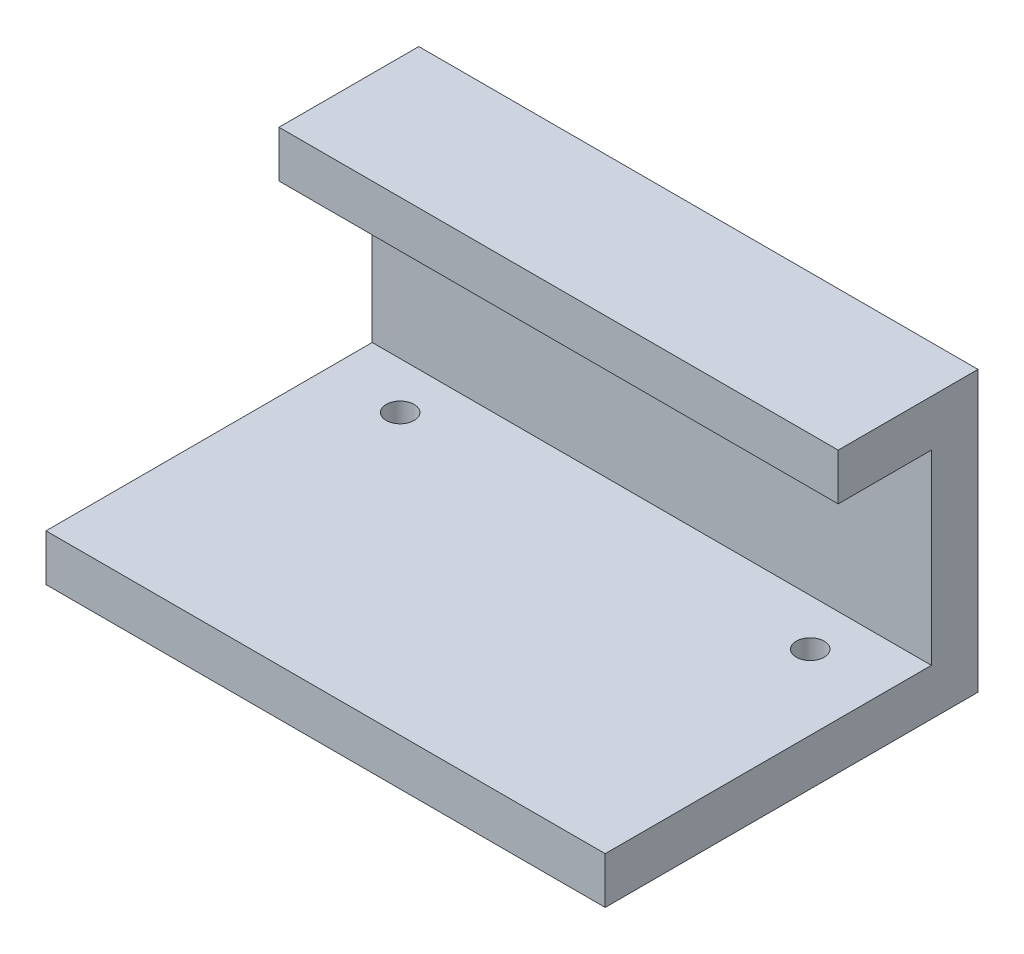
ISO-10303-21;
HEADER;
FILE_DESCRIPTION(('STEP AP214'),'2;1');
FILE_NAME('part.step','',(''),(''),'','','');
FILE_SCHEMA(('AUTOMOTIVE_DESIGN { 1 0 10303 214 1 1 1 1 }'));
ENDSEC;
DATA;
#1=APPLICATION_CONTEXT('core data for automotive mechanical design processes');
#2=APPLICATION_PROTOCOL_DEFINITION('international standard','automotive_design',2000,#1);
#3=PRODUCT_CONTEXT('',#1,'mechanical');
#4=PRODUCT('Part','Part','',(#3));
#5=PRODUCT_RELATED_PRODUCT_CATEGORY('part','',(#4));
#6=PRODUCT_DEFINITION_FORMATION('','',#4);
#7=PRODUCT_DEFINITION_CONTEXT('part definition',#1,'design');
#8=PRODUCT_DEFINITION('design','',#6,#7);
#9=PRODUCT_DEFINITION_SHAPE('','',#8);
#10=(LENGTH_UNIT() NAMED_UNIT(*) SI_UNIT(.MILLI.,.METRE.));
#11=(NAMED_UNIT(*) PLANE_ANGLE_UNIT() SI_UNIT($,.RADIAN.));
#12=(NAMED_UNIT(*) SI_UNIT($,.STERADIAN.) SOLID_ANGLE_UNIT());
#13=UNCERTAINTY_MEASURE_WITH_UNIT(LENGTH_MEASURE(1.E-05),#10,'distance_accuracy_value','');
#14=(GEOMETRIC_REPRESENTATION_CONTEXT(3) GLOBAL_UNCERTAINTY_ASSIGNED_CONTEXT((#13)) GLOBAL_UNIT_ASSIGNED_CONTEXT((#10,
#11,#12)) REPRESENTATION_CONTEXT('',''));
#15=CARTESIAN_POINT('',(0.,0.,0.));
#16=DIRECTION('',(0.,0.,1.));
#17=DIRECTION('',(1.,0.,0.));
#18=AXIS2_PLACEMENT_3D('',#15,#16,#17);
#19=CARTESIAN_POINT('',(-30.,30.,-15.));
#20=DIRECTION('',(0.,0.,-1.));
#21=DIRECTION('',(-1.,0.,0.));
#22=AXIS2_PLACEMENT_3D('',#19,#20,#21);
#23=PLANE('',#22);
#24=DIRECTION('',(1.,0.,0.));
#25=VECTOR('',#24,1.);
#26=CARTESIAN_POINT('',(30.,25.,-15.));
#27=LINE('',#26,#25);
#28=CARTESIAN_POINT('',(-30.,25.,-15.));
#29=VERTEX_POINT('',#28);
#30=CARTESIAN_POINT('',(30.,25.,-15.));
#31=VERTEX_POINT('',#30);
#32=EDGE_CURVE('E163',#29,#31,#27,.T.);
#33=ORIENTED_EDGE('',*,*,#32,.F.);
#34=DIRECTION('',(0.,-1.,0.));
#35=VECTOR('',#34,1.);
#36=CARTESIAN_POINT('',(-30.,30.,-15.));
#37=LINE('',#36,#35);
#38=CARTESIAN_POINT('',(-30.,5.,-15.));
#39=VERTEX_POINT('',#38);
#40=EDGE_CURVE('E55',#29,#39,#37,.T.);
#41=ORIENTED_EDGE('',*,*,#40,.T.);
#42=DIRECTION('',(1.,0.,0.));
#43=VECTOR('',#42,1.);
#44=CARTESIAN_POINT('',(-30.,5.,-15.));
#45=LINE('',#44,#43);
#46=CARTESIAN_POINT('',(30.,5.,-15.));
#47=VERTEX_POINT('',#46);
#48=EDGE_CURVE('E143',#39,#47,#45,.T.);
#49=ORIENTED_EDGE('',*,*,#48,.T.);
#50=DIRECTION('',(0.,-1.,0.));
#51=VECTOR('',#50,1.);
#52=CARTESIAN_POINT('',(30.,30.,-15.));
#53=LINE('',#52,#51);
#54=EDGE_CURVE('E117',#31,#47,#53,.T.);
#55=ORIENTED_EDGE('',*,*,#54,.F.);
#56=EDGE_LOOP('',(#33,#41,#49,#55));
#57=FACE_BOUND('',#56,.T.);
#58=ADVANCED_FACE('F39',(#57),#23,.F.);
#59=CARTESIAN_POINT('',(-30.,5.,20.));
#60=DIRECTION('',(1.,0.,0.));
#61=DIRECTION('',(0.,0.,-1.));
#62=AXIS2_PLACEMENT_3D('',#59,#60,#61);
#63=PLANE('',#62);
#64=DIRECTION('',(0.,0.,1.));
#65=VECTOR('',#64,1.);
#66=CARTESIAN_POINT('',(-30.,0.,20.));
#67=LINE('',#66,#65);
#68=CARTESIAN_POINT('',(-30.,0.,-20.));
#69=VERTEX_POINT('',#68);
#70=CARTESIAN_POINT('',(-30.,0.,20.));
#71=VERTEX_POINT('',#70);
#72=EDGE_CURVE('E103',#69,#71,#67,.T.);
#73=ORIENTED_EDGE('',*,*,#72,.T.);
#74=DIRECTION('',(0.,-1.,0.));
#75=VECTOR('',#74,1.);
#76=CARTESIAN_POINT('',(-30.,5.,20.));
#77=LINE('',#76,#75);
#78=CARTESIAN_POINT('',(-30.,5.,20.));
#79=VERTEX_POINT('',#78);
#80=EDGE_CURVE('E11',#79,#71,#77,.T.);
#81=ORIENTED_EDGE('',*,*,#80,.F.);
#82=DIRECTION('',(0.,0.,1.));
#83=VECTOR('',#82,1.);
#84=CARTESIAN_POINT('',(-30.,5.,20.));
#85=LINE('',#84,#83);
#86=EDGE_CURVE('E96',#39,#79,#85,.T.);
#87=ORIENTED_EDGE('',*,*,#86,.F.);
#88=ORIENTED_EDGE('',*,*,#40,.F.);
#89=DIRECTION('',(0.,0.,-1.));
#90=VECTOR('',#89,1.);
#91=CARTESIAN_POINT('',(-30.,25.,-4.99999999999999));
#92=LINE('',#91,#90);
#93=CARTESIAN_POINT('',(-30.,25.,-4.99999999999999));
#94=VERTEX_POINT('',#93);
#95=EDGE_CURVE('E146',#94,#29,#92,.T.);
#96=ORIENTED_EDGE('',*,*,#95,.F.);
#97=DIRECTION('',(0.,-1.,0.));
#98=VECTOR('',#97,1.);
#99=CARTESIAN_POINT('',(-30.,30.,-4.99999999999999));
#100=LINE('',#99,#98);
#101=CARTESIAN_POINT('',(-30.,30.,-4.99999999999999));
#102=VERTEX_POINT('',#101);
#103=EDGE_CURVE('E172',#102,#94,#100,.T.);
#104=ORIENTED_EDGE('',*,*,#103,.F.);
#105=DIRECTION('',(0.,0.,1.));
#106=VECTOR('',#105,1.);
#107=CARTESIAN_POINT('',(-30.,30.,-20.));
#108=LINE('',#107,#106);
#109=CARTESIAN_POINT('',(-30.,30.,-20.));
#110=VERTEX_POINT('',#109);
#111=EDGE_CURVE('E106',#110,#102,#108,.T.);
#112=ORIENTED_EDGE('',*,*,#111,.F.);
#113=DIRECTION('',(0.,-1.,0.));
#114=VECTOR('',#113,1.);
#115=CARTESIAN_POINT('',(-30.,5.,-20.));
#116=LINE('',#115,#114);
#117=EDGE_CURVE('E88',#110,#69,#116,.T.);
#118=ORIENTED_EDGE('',*,*,#117,.T.);
#119=EDGE_LOOP('',(#73,#81,#87,#88,#96,#104,#112,#118));
#120=FACE_BOUND('',#119,.T.);
#121=ADVANCED_FACE('F41',(#120),#63,.F.);
#122=CARTESIAN_POINT('',(30.,5.,20.));
#123=DIRECTION('',(0.,0.,-1.));
#124=DIRECTION('',(-1.,0.,0.));
#125=AXIS2_PLACEMENT_3D('',#122,#123,#124);
#126=PLANE('',#125);
#127=DIRECTION('',(1.,0.,0.));
#128=VECTOR('',#127,1.);
#129=CARTESIAN_POINT('',(30.,0.,20.));
#130=LINE('',#129,#128);
#131=CARTESIAN_POINT('',(30.,0.,20.));
#132=VERTEX_POINT('',#131);
#133=EDGE_CURVE('E111',#71,#132,#130,.T.);
#134=ORIENTED_EDGE('',*,*,#133,.T.);
#135=DIRECTION('',(0.,-1.,0.));
#136=VECTOR('',#135,1.);
#137=CARTESIAN_POINT('',(30.,5.,20.));
#138=LINE('',#137,#136);
#139=CARTESIAN_POINT('',(30.,5.,20.));
#140=VERTEX_POINT('',#139);
#141=EDGE_CURVE('E48',#140,#132,#138,.T.);
#142=ORIENTED_EDGE('',*,*,#141,.F.);
#143=DIRECTION('',(1.,0.,0.));
#144=VECTOR('',#143,1.);
#145=CARTESIAN_POINT('',(30.,5.,20.));
#146=LINE('',#145,#144);
#147=EDGE_CURVE('E64',#79,#140,#146,.T.);
#148=ORIENTED_EDGE('',*,*,#147,.F.);
#149=ORIENTED_EDGE('',*,*,#80,.T.);
#150=EDGE_LOOP('',(#134,#142,#148,#149));
#151=FACE_BOUND('',#150,.T.);
#152=ADVANCED_FACE('F132',(#151),#126,.F.);
#153=CARTESIAN_POINT('',(30.,5.,20.));
#154=DIRECTION('',(-1.,0.,0.));
#155=DIRECTION('',(0.,0.,1.));
#156=AXIS2_PLACEMENT_3D('',#153,#154,#155);
#157=PLANE('',#156);
#158=DIRECTION('',(0.,0.,-1.));
#159=VECTOR('',#158,1.);
#160=CARTESIAN_POINT('',(30.,0.,20.));
#161=LINE('',#160,#159);
#162=CARTESIAN_POINT('',(30.,0.,-20.));
#163=VERTEX_POINT('',#162);
#164=EDGE_CURVE('E97',#132,#163,#161,.T.);
#165=ORIENTED_EDGE('',*,*,#164,.T.);
#166=DIRECTION('',(0.,-1.,0.));
#167=VECTOR('',#166,1.);
#168=CARTESIAN_POINT('',(30.,5.,-20.));
#169=LINE('',#168,#167);
#170=CARTESIAN_POINT('',(30.,30.,-20.));
#171=VERTEX_POINT('',#170);
#172=EDGE_CURVE('E91',#171,#163,#169,.T.);
#173=ORIENTED_EDGE('',*,*,#172,.F.);
#174=DIRECTION('',(0.,0.,-1.));
#175=VECTOR('',#174,1.);
#176=CARTESIAN_POINT('',(30.,30.,-20.));
#177=LINE('',#176,#175);
#178=CARTESIAN_POINT('',(30.,30.,-4.99999999999999));
#179=VERTEX_POINT('',#178);
#180=EDGE_CURVE('E149',#179,#171,#177,.T.);
#181=ORIENTED_EDGE('',*,*,#180,.F.);
#182=DIRECTION('',(0.,1.,0.));
#183=VECTOR('',#182,1.);
#184=CARTESIAN_POINT('',(30.,30.,-4.99999999999999));
#185=LINE('',#184,#183);
#186=CARTESIAN_POINT('',(30.,25.,-4.99999999999999));
#187=VERTEX_POINT('',#186);
#188=EDGE_CURVE('E167',#187,#179,#185,.T.);
#189=ORIENTED_EDGE('',*,*,#188,.F.);
#190=DIRECTION('',(0.,0.,-1.));
#191=VECTOR('',#190,1.);
#192=CARTESIAN_POINT('',(30.,25.,-4.99999999999999));
#193=LINE('',#192,#191);
#194=EDGE_CURVE('E158',#187,#31,#193,.T.);
#195=ORIENTED_EDGE('',*,*,#194,.T.);
#196=ORIENTED_EDGE('',*,*,#54,.T.);
#197=DIRECTION('',(0.,0.,-1.));
#198=VECTOR('',#197,1.);
#199=CARTESIAN_POINT('',(30.,5.,20.));
#200=LINE('',#199,#198);
#201=EDGE_CURVE('E108',#140,#47,#200,.T.);
#202=ORIENTED_EDGE('',*,*,#201,.F.);
#203=ORIENTED_EDGE('',*,*,#141,.T.);
#204=EDGE_LOOP('',(#165,#173,#181,#189,#195,#196,#202,#203));
#205=FACE_BOUND('',#204,.T.);
#206=ADVANCED_FACE('F129',(#205),#157,.F.);
#207=CARTESIAN_POINT('',(30.,5.,-20.));
#208=DIRECTION('',(0.,0.,1.));
#209=DIRECTION('',(1.,0.,0.));
#210=AXIS2_PLACEMENT_3D('',#207,#208,#209);
#211=PLANE('',#210);
#212=DIRECTION('',(-1.,0.,0.));
#213=VECTOR('',#212,1.);
#214=CARTESIAN_POINT('',(30.,0.,-20.));
#215=LINE('',#214,#213);
#216=EDGE_CURVE('E84',#163,#69,#215,.T.);
#217=ORIENTED_EDGE('',*,*,#216,.T.);
#218=ORIENTED_EDGE('',*,*,#117,.F.);
#219=DIRECTION('',(-1.,0.,0.));
#220=VECTOR('',#219,1.);
#221=CARTESIAN_POINT('',(-30.,30.,-20.));
#222=LINE('',#221,#220);
#223=EDGE_CURVE('E142',#171,#110,#222,.T.);
#224=ORIENTED_EDGE('',*,*,#223,.F.);
#225=ORIENTED_EDGE('',*,*,#172,.T.);
#226=EDGE_LOOP('',(#217,#218,#224,#225));
#227=FACE_BOUND('',#226,.T.);
#228=ADVANCED_FACE('F86',(#227),#211,.F.);
#229=CARTESIAN_POINT('',(0.,5.,0.));
#230=DIRECTION('',(0.,1.,0.));
#231=DIRECTION('',(0.,0.,1.));
#232=AXIS2_PLACEMENT_3D('',#229,#230,#231);
#233=PLANE('',#232);
#234=CARTESIAN_POINT('',(22.,5.,-9.99999999999999));
#235=DIRECTION('',(0.,-1.,0.));
#236=DIRECTION('',(0.,0.,-1.));
#237=AXIS2_PLACEMENT_3D('',#234,#235,#236);
#238=CIRCLE('',#237,1.5);
#239=CARTESIAN_POINT('',(22.,5.,-11.5));
#240=VERTEX_POINT('',#239);
#241=EDGE_CURVE('E168',#240,#240,#238,.T.);
#242=ORIENTED_EDGE('',*,*,#241,.T.);
#243=EDGE_LOOP('',(#242));
#244=FACE_BOUND('',#243,.T.);
#245=CARTESIAN_POINT('',(-22.,5.,-10.));
#246=DIRECTION('',(0.,-1.,0.));
#247=DIRECTION('',(0.,0.,-1.));
#248=AXIS2_PLACEMENT_3D('',#245,#246,#247);
#249=CIRCLE('',#248,1.5);
#250=CARTESIAN_POINT('',(-22.,5.,-11.5));
#251=VERTEX_POINT('',#250);
#252=EDGE_CURVE('E187',#251,#251,#249,.T.);
#253=ORIENTED_EDGE('',*,*,#252,.T.);
#254=EDGE_LOOP('',(#253));
#255=FACE_BOUND('',#254,.T.);
#256=ORIENTED_EDGE('',*,*,#48,.F.);
#257=ORIENTED_EDGE('',*,*,#86,.T.);
#258=ORIENTED_EDGE('',*,*,#147,.T.);
#259=ORIENTED_EDGE('',*,*,#201,.T.);
#260=EDGE_LOOP('',(#256,#257,#258,#259));
#261=FACE_BOUND('',#260,.T.);
#262=ADVANCED_FACE('F199',(#244,#255,#261),#233,.T.);
#263=CARTESIAN_POINT('',(0.,0.,0.));
#264=DIRECTION('',(0.,1.,0.));
#265=DIRECTION('',(0.,0.,1.));
#266=AXIS2_PLACEMENT_3D('',#263,#264,#265);
#267=PLANE('',#266);
#268=CARTESIAN_POINT('',(22.,0.,-9.99999999999999));
#269=DIRECTION('',(0.,-1.,0.));
#270=DIRECTION('',(0.,0.,-1.));
#271=AXIS2_PLACEMENT_3D('',#268,#269,#270);
#272=CIRCLE('',#271,1.5);
#273=CARTESIAN_POINT('',(22.,0.,-11.5));
#274=VERTEX_POINT('',#273);
#275=EDGE_CURVE('E191',#274,#274,#272,.T.);
#276=ORIENTED_EDGE('',*,*,#275,.F.);
#277=EDGE_LOOP('',(#276));
#278=FACE_BOUND('',#277,.T.);
#279=CARTESIAN_POINT('',(-22.,0.,-10.));
#280=DIRECTION('',(0.,-1.,0.));
#281=DIRECTION('',(0.,0.,-1.));
#282=AXIS2_PLACEMENT_3D('',#279,#280,#281);
#283=CIRCLE('',#282,1.5);
#284=CARTESIAN_POINT('',(-22.,0.,-11.5));
#285=VERTEX_POINT('',#284);
#286=EDGE_CURVE('E183',#285,#285,#283,.T.);
#287=ORIENTED_EDGE('',*,*,#286,.F.);
#288=EDGE_LOOP('',(#287));
#289=FACE_BOUND('',#288,.T.);
#290=ORIENTED_EDGE('',*,*,#72,.F.);
#291=ORIENTED_EDGE('',*,*,#216,.F.);
#292=ORIENTED_EDGE('',*,*,#164,.F.);
#293=ORIENTED_EDGE('',*,*,#133,.F.);
#294=EDGE_LOOP('',(#290,#291,#292,#293));
#295=FACE_BOUND('',#294,.T.);
#296=ADVANCED_FACE('F110',(#278,#289,#295),#267,.F.);
#297=CARTESIAN_POINT('',(0.,30.,0.));
#298=DIRECTION('',(0.,1.,0.));
#299=DIRECTION('',(0.,0.,1.));
#300=AXIS2_PLACEMENT_3D('',#297,#298,#299);
#301=PLANE('',#300);
#302=ORIENTED_EDGE('',*,*,#111,.T.);
#303=DIRECTION('',(-1.,0.,0.));
#304=VECTOR('',#303,1.);
#305=CARTESIAN_POINT('',(30.,30.,-4.99999999999999));
#306=LINE('',#305,#304);
#307=EDGE_CURVE('E176',#179,#102,#306,.T.);
#308=ORIENTED_EDGE('',*,*,#307,.F.);
#309=ORIENTED_EDGE('',*,*,#180,.T.);
#310=ORIENTED_EDGE('',*,*,#223,.T.);
#311=EDGE_LOOP('',(#302,#308,#309,#310));
#312=FACE_BOUND('',#311,.T.);
#313=ADVANCED_FACE('F211',(#312),#301,.T.);
#314=CARTESIAN_POINT('',(30.,25.,-4.99999999999999));
#315=DIRECTION('',(0.,1.,0.));
#316=DIRECTION('',(-1.,0.,0.));
#317=AXIS2_PLACEMENT_3D('',#314,#315,#316);
#318=PLANE('',#317);
#319=ORIENTED_EDGE('',*,*,#32,.T.);
#320=ORIENTED_EDGE('',*,*,#194,.F.);
#321=DIRECTION('',(1.,0.,0.));
#322=VECTOR('',#321,1.);
#323=CARTESIAN_POINT('',(30.,25.,-4.99999999999999));
#324=LINE('',#323,#322);
#325=EDGE_CURVE('E162',#94,#187,#324,.T.);
#326=ORIENTED_EDGE('',*,*,#325,.F.);
#327=ORIENTED_EDGE('',*,*,#95,.T.);
#328=EDGE_LOOP('',(#319,#320,#326,#327));
#329=FACE_BOUND('',#328,.T.);
#330=ADVANCED_FACE('F222',(#329),#318,.F.);
#331=CARTESIAN_POINT('',(0.,0.,-4.99999999999999));
#332=DIRECTION('',(0.,0.,-1.));
#333=DIRECTION('',(-1.,0.,0.));
#334=AXIS2_PLACEMENT_3D('',#331,#332,#333);
#335=PLANE('',#334);
#336=ORIENTED_EDGE('',*,*,#188,.T.);
#337=ORIENTED_EDGE('',*,*,#307,.T.);
#338=ORIENTED_EDGE('',*,*,#103,.T.);
#339=ORIENTED_EDGE('',*,*,#325,.T.);
#340=EDGE_LOOP('',(#336,#337,#338,#339));
#341=FACE_BOUND('',#340,.T.);
#342=ADVANCED_FACE('F216',(#341),#335,.F.);
#343=CARTESIAN_POINT('',(-22.,5.,-10.));
#344=DIRECTION('',(0.,-1.,0.));
#345=DIRECTION('',(0.,0.,-1.));
#346=AXIS2_PLACEMENT_3D('',#343,#344,#345);
#347=CYLINDRICAL_SURFACE('',#346,1.5);
#348=ORIENTED_EDGE('',*,*,#252,.F.);
#349=EDGE_LOOP('',(#348));
#350=FACE_BOUND('',#349,.T.);
#351=ORIENTED_EDGE('',*,*,#286,.T.);
#352=EDGE_LOOP('',(#351));
#353=FACE_BOUND('',#352,.T.);
#354=ADVANCED_FACE('F205',(#350,#353),#347,.F.);
#355=CARTESIAN_POINT('',(22.,5.,-9.99999999999999));
#356=DIRECTION('',(0.,-1.,0.));
#357=DIRECTION('',(0.,0.,-1.));
#358=AXIS2_PLACEMENT_3D('',#355,#356,#357);
#359=CYLINDRICAL_SURFACE('',#358,1.5);
#360=ORIENTED_EDGE('',*,*,#241,.F.);
#361=EDGE_LOOP('',(#360));
#362=FACE_BOUND('',#361,.T.);
#363=ORIENTED_EDGE('',*,*,#275,.T.);
#364=EDGE_LOOP('',(#363));
#365=FACE_BOUND('',#364,.T.);
#366=ADVANCED_FACE('F202',(#362,#365),#359,.F.);
#367=CLOSED_SHELL('',(#58,#121,#152,#206,#228,#262,#296,#313,#330,#342,#354,#366));
#368=MANIFOLD_SOLID_BREP('B2',#367);
#369=ADVANCED_BREP_SHAPE_REPRESENTATION('',(#18,#368),#14);
#370=SHAPE_DEFINITION_REPRESENTATION(#9,#369);
ENDSEC;
END-ISO-10303-21;
